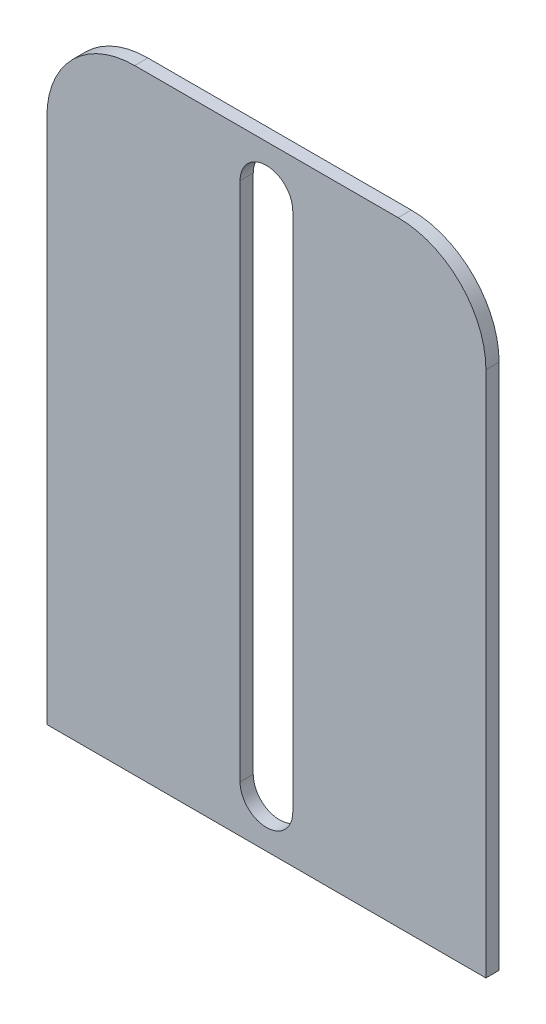
ISO-10303-21;
HEADER;
FILE_DESCRIPTION(('STEP AP214'),'2;1');
FILE_NAME('part.step','',(''),(''),'','','');
FILE_SCHEMA(('AUTOMOTIVE_DESIGN { 1 0 10303 214 1 1 1 1 }'));
ENDSEC;
DATA;
#1=APPLICATION_CONTEXT('core data for automotive mechanical design processes');
#2=APPLICATION_PROTOCOL_DEFINITION('international standard','automotive_design',2000,#1);
#3=PRODUCT_CONTEXT('',#1,'mechanical');
#4=PRODUCT('Part','Part','',(#3));
#5=PRODUCT_RELATED_PRODUCT_CATEGORY('part','',(#4));
#6=PRODUCT_DEFINITION_FORMATION('','',#4);
#7=PRODUCT_DEFINITION_CONTEXT('part definition',#1,'design');
#8=PRODUCT_DEFINITION('design','',#6,#7);
#9=PRODUCT_DEFINITION_SHAPE('','',#8);
#10=(LENGTH_UNIT() NAMED_UNIT(*) SI_UNIT(.MILLI.,.METRE.));
#11=(NAMED_UNIT(*) PLANE_ANGLE_UNIT() SI_UNIT($,.RADIAN.));
#12=(NAMED_UNIT(*) SI_UNIT($,.STERADIAN.) SOLID_ANGLE_UNIT());
#13=UNCERTAINTY_MEASURE_WITH_UNIT(LENGTH_MEASURE(1.E-05),#10,'distance_accuracy_value','');
#14=(GEOMETRIC_REPRESENTATION_CONTEXT(3) GLOBAL_UNCERTAINTY_ASSIGNED_CONTEXT((#13)) GLOBAL_UNIT_ASSIGNED_CONTEXT((#10,
#11,#12)) REPRESENTATION_CONTEXT('',''));
#15=CARTESIAN_POINT('',(0.,0.,0.));
#16=DIRECTION('',(0.,0.,1.));
#17=DIRECTION('',(1.,0.,0.));
#18=AXIS2_PLACEMENT_3D('',#15,#16,#17);
#19=CARTESIAN_POINT('',(0.,0.,1.5));
#20=DIRECTION('',(0.,0.,-1.));
#21=DIRECTION('',(-1.,0.,0.));
#22=AXIS2_PLACEMENT_3D('',#19,#20,#21);
#23=PLANE('',#22);
#24=DIRECTION('',(-1.,0.,0.));
#25=VECTOR('',#24,1.);
#26=CARTESIAN_POINT('',(-25.,35.,1.5));
#27=LINE('',#26,#25);
#28=CARTESIAN_POINT('',(15.,35.,1.5));
#29=VERTEX_POINT('',#28);
#30=CARTESIAN_POINT('',(-15.,35.,1.5));
#31=VERTEX_POINT('',#30);
#32=EDGE_CURVE('E157',#29,#31,#27,.T.);
#33=ORIENTED_EDGE('',*,*,#32,.T.);
#34=CARTESIAN_POINT('',(-15.,25.,1.5));
#35=DIRECTION('',(0.,0.,-1.));
#36=DIRECTION('',(-1.,0.,0.));
#37=AXIS2_PLACEMENT_3D('',#34,#35,#36);
#38=CIRCLE('',#37,10.);
#39=CARTESIAN_POINT('',(-25.,25.,1.5));
#40=VERTEX_POINT('',#39);
#41=EDGE_CURVE('E42',#31,#40,#38,.F.);
#42=ORIENTED_EDGE('',*,*,#41,.T.);
#43=DIRECTION('',(0.,-1.,0.));
#44=VECTOR('',#43,1.);
#45=CARTESIAN_POINT('',(-25.,-35.,1.5));
#46=LINE('',#45,#44);
#47=CARTESIAN_POINT('',(-25.,-35.,1.5));
#48=VERTEX_POINT('',#47);
#49=EDGE_CURVE('E160',#40,#48,#46,.T.);
#50=ORIENTED_EDGE('',*,*,#49,.T.);
#51=DIRECTION('',(1.,0.,0.));
#52=VECTOR('',#51,1.);
#53=CARTESIAN_POINT('',(-25.,-35.,1.5));
#54=LINE('',#53,#52);
#55=CARTESIAN_POINT('',(25.,-35.,1.5));
#56=VERTEX_POINT('',#55);
#57=EDGE_CURVE('E162',#48,#56,#54,.T.);
#58=ORIENTED_EDGE('',*,*,#57,.T.);
#59=DIRECTION('',(0.,1.,0.));
#60=VECTOR('',#59,1.);
#61=CARTESIAN_POINT('',(25.,-35.,1.5));
#62=LINE('',#61,#60);
#63=CARTESIAN_POINT('',(25.,25.,1.5));
#64=VERTEX_POINT('',#63);
#65=EDGE_CURVE('E155',#56,#64,#62,.T.);
#66=ORIENTED_EDGE('',*,*,#65,.T.);
#67=CARTESIAN_POINT('',(15.,25.,1.5));
#68=DIRECTION('',(0.,0.,-1.));
#69=DIRECTION('',(-1.,0.,0.));
#70=AXIS2_PLACEMENT_3D('',#67,#68,#69);
#71=CIRCLE('',#70,10.);
#72=EDGE_CURVE('E187',#64,#29,#71,.F.);
#73=ORIENTED_EDGE('',*,*,#72,.T.);
#74=EDGE_LOOP('',(#33,#42,#50,#58,#66,#73));
#75=FACE_BOUND('',#74,.T.);
#76=CARTESIAN_POINT('',(0.,-29.6532805848947,1.5));
#77=DIRECTION('',(0.,0.,1.));
#78=DIRECTION('',(1.,0.,0.));
#79=AXIS2_PLACEMENT_3D('',#76,#77,#78);
#80=CIRCLE('',#79,3.);
#81=CARTESIAN_POINT('',(-3.,-29.6532805848947,1.5));
#82=VERTEX_POINT('',#81);
#83=CARTESIAN_POINT('',(3.,-29.6532805848947,1.5));
#84=VERTEX_POINT('',#83);
#85=EDGE_CURVE('E114',#82,#84,#80,.T.);
#86=ORIENTED_EDGE('',*,*,#85,.F.);
#87=DIRECTION('',(0.,-1.,0.));
#88=VECTOR('',#87,1.);
#89=CARTESIAN_POINT('',(-3.,-29.6532805848947,1.5));
#90=LINE('',#89,#88);
#91=CARTESIAN_POINT('',(-3.,29.6532805848947,1.5));
#92=VERTEX_POINT('',#91);
#93=EDGE_CURVE('E139',#92,#82,#90,.T.);
#94=ORIENTED_EDGE('',*,*,#93,.F.);
#95=CARTESIAN_POINT('',(0.,29.6532805848947,1.5));
#96=DIRECTION('',(0.,0.,1.));
#97=DIRECTION('',(1.,0.,0.));
#98=AXIS2_PLACEMENT_3D('',#95,#96,#97);
#99=CIRCLE('',#98,3.);
#100=CARTESIAN_POINT('',(3.,29.6532805848947,1.5));
#101=VERTEX_POINT('',#100);
#102=EDGE_CURVE('E137',#101,#92,#99,.T.);
#103=ORIENTED_EDGE('',*,*,#102,.F.);
#104=DIRECTION('',(0.,1.,0.));
#105=VECTOR('',#104,1.);
#106=CARTESIAN_POINT('',(3.,-29.6532805848947,1.5));
#107=LINE('',#106,#105);
#108=EDGE_CURVE('E124',#84,#101,#107,.T.);
#109=ORIENTED_EDGE('',*,*,#108,.F.);
#110=EDGE_LOOP('',(#86,#94,#103,#109));
#111=FACE_BOUND('',#110,.T.);
#112=ADVANCED_FACE('F34',(#75,#111),#23,.F.);
#113=CARTESIAN_POINT('',(0.,0.,0.));
#114=DIRECTION('',(0.,0.,-1.));
#115=DIRECTION('',(-1.,0.,0.));
#116=AXIS2_PLACEMENT_3D('',#113,#114,#115);
#117=PLANE('',#116);
#118=DIRECTION('',(0.,-1.,0.));
#119=VECTOR('',#118,1.);
#120=CARTESIAN_POINT('',(-25.,-35.,0.));
#121=LINE('',#120,#119);
#122=CARTESIAN_POINT('',(-25.,25.,0.));
#123=VERTEX_POINT('',#122);
#124=CARTESIAN_POINT('',(-25.,-35.,0.));
#125=VERTEX_POINT('',#124);
#126=EDGE_CURVE('E168',#123,#125,#121,.T.);
#127=ORIENTED_EDGE('',*,*,#126,.F.);
#128=CARTESIAN_POINT('',(-15.,25.,0.));
#129=DIRECTION('',(0.,0.,-1.));
#130=DIRECTION('',(-1.,0.,0.));
#131=AXIS2_PLACEMENT_3D('',#128,#129,#130);
#132=CIRCLE('',#131,10.);
#133=CARTESIAN_POINT('',(-15.,35.,0.));
#134=VERTEX_POINT('',#133);
#135=EDGE_CURVE('E181',#123,#134,#132,.T.);
#136=ORIENTED_EDGE('',*,*,#135,.T.);
#137=DIRECTION('',(-1.,0.,0.));
#138=VECTOR('',#137,1.);
#139=CARTESIAN_POINT('',(-25.,35.,0.));
#140=LINE('',#139,#138);
#141=CARTESIAN_POINT('',(15.,35.,0.));
#142=VERTEX_POINT('',#141);
#143=EDGE_CURVE('E166',#142,#134,#140,.T.);
#144=ORIENTED_EDGE('',*,*,#143,.F.);
#145=CARTESIAN_POINT('',(15.,25.,0.));
#146=DIRECTION('',(0.,0.,-1.));
#147=DIRECTION('',(-1.,0.,0.));
#148=AXIS2_PLACEMENT_3D('',#145,#146,#147);
#149=CIRCLE('',#148,10.);
#150=CARTESIAN_POINT('',(25.,25.,0.));
#151=VERTEX_POINT('',#150);
#152=EDGE_CURVE('E179',#142,#151,#149,.T.);
#153=ORIENTED_EDGE('',*,*,#152,.T.);
#154=DIRECTION('',(0.,1.,0.));
#155=VECTOR('',#154,1.);
#156=CARTESIAN_POINT('',(25.,-35.,0.));
#157=LINE('',#156,#155);
#158=CARTESIAN_POINT('',(25.,-35.,0.));
#159=VERTEX_POINT('',#158);
#160=EDGE_CURVE('E132',#159,#151,#157,.T.);
#161=ORIENTED_EDGE('',*,*,#160,.F.);
#162=DIRECTION('',(1.,0.,0.));
#163=VECTOR('',#162,1.);
#164=CARTESIAN_POINT('',(-25.,-35.,0.));
#165=LINE('',#164,#163);
#166=EDGE_CURVE('E158',#125,#159,#165,.T.);
#167=ORIENTED_EDGE('',*,*,#166,.F.);
#168=EDGE_LOOP('',(#127,#136,#144,#153,#161,#167));
#169=FACE_BOUND('',#168,.T.);
#170=DIRECTION('',(0.,-1.,0.));
#171=VECTOR('',#170,1.);
#172=CARTESIAN_POINT('',(-3.,-29.6532805848947,0.));
#173=LINE('',#172,#171);
#174=CARTESIAN_POINT('',(-3.,29.6532805848947,0.));
#175=VERTEX_POINT('',#174);
#176=CARTESIAN_POINT('',(-3.,-29.6532805848947,0.));
#177=VERTEX_POINT('',#176);
#178=EDGE_CURVE('E125',#175,#177,#173,.T.);
#179=ORIENTED_EDGE('',*,*,#178,.T.);
#180=CARTESIAN_POINT('',(0.,-29.6532805848947,0.));
#181=DIRECTION('',(0.,0.,1.));
#182=DIRECTION('',(1.,0.,0.));
#183=AXIS2_PLACEMENT_3D('',#180,#181,#182);
#184=CIRCLE('',#183,3.);
#185=CARTESIAN_POINT('',(3.,-29.6532805848947,0.));
#186=VERTEX_POINT('',#185);
#187=EDGE_CURVE('E143',#177,#186,#184,.T.);
#188=ORIENTED_EDGE('',*,*,#187,.T.);
#189=DIRECTION('',(0.,1.,0.));
#190=VECTOR('',#189,1.);
#191=CARTESIAN_POINT('',(3.,-29.6532805848947,0.));
#192=LINE('',#191,#190);
#193=CARTESIAN_POINT('',(3.,29.6532805848947,0.));
#194=VERTEX_POINT('',#193);
#195=EDGE_CURVE('E131',#186,#194,#192,.T.);
#196=ORIENTED_EDGE('',*,*,#195,.T.);
#197=CARTESIAN_POINT('',(0.,29.6532805848947,0.));
#198=DIRECTION('',(0.,0.,1.));
#199=DIRECTION('',(1.,0.,0.));
#200=AXIS2_PLACEMENT_3D('',#197,#198,#199);
#201=CIRCLE('',#200,3.);
#202=EDGE_CURVE('E146',#194,#175,#201,.T.);
#203=ORIENTED_EDGE('',*,*,#202,.T.);
#204=EDGE_LOOP('',(#179,#188,#196,#203));
#205=FACE_BOUND('',#204,.T.);
#206=ADVANCED_FACE('F201',(#169,#205),#117,.T.);
#207=CARTESIAN_POINT('',(25.,-35.,1.5));
#208=DIRECTION('',(-1.,0.,0.));
#209=DIRECTION('',(0.,0.,1.));
#210=AXIS2_PLACEMENT_3D('',#207,#208,#209);
#211=PLANE('',#210);
#212=ORIENTED_EDGE('',*,*,#160,.T.);
#213=DIRECTION('',(0.,0.,-1.));
#214=VECTOR('',#213,1.);
#215=CARTESIAN_POINT('',(25.,25.,1.5));
#216=LINE('',#215,#214);
#217=EDGE_CURVE('E11',#151,#64,#216,.F.);
#218=ORIENTED_EDGE('',*,*,#217,.T.);
#219=ORIENTED_EDGE('',*,*,#65,.F.);
#220=DIRECTION('',(0.,0.,-1.));
#221=VECTOR('',#220,1.);
#222=CARTESIAN_POINT('',(25.,-35.,1.5));
#223=LINE('',#222,#221);
#224=EDGE_CURVE('E164',#56,#159,#223,.T.);
#225=ORIENTED_EDGE('',*,*,#224,.T.);
#226=EDGE_LOOP('',(#212,#218,#219,#225));
#227=FACE_BOUND('',#226,.T.);
#228=ADVANCED_FACE('F209',(#227),#211,.F.);
#229=CARTESIAN_POINT('',(-25.,35.,1.5));
#230=DIRECTION('',(0.,-1.,0.));
#231=DIRECTION('',(0.,0.,-1.));
#232=AXIS2_PLACEMENT_3D('',#229,#230,#231);
#233=PLANE('',#232);
#234=ORIENTED_EDGE('',*,*,#143,.T.);
#235=DIRECTION('',(0.,0.,-1.));
#236=VECTOR('',#235,1.);
#237=CARTESIAN_POINT('',(-15.,35.,1.5));
#238=LINE('',#237,#236);
#239=EDGE_CURVE('E55',#134,#31,#238,.F.);
#240=ORIENTED_EDGE('',*,*,#239,.T.);
#241=ORIENTED_EDGE('',*,*,#32,.F.);
#242=DIRECTION('',(0.,0.,-1.));
#243=VECTOR('',#242,1.);
#244=CARTESIAN_POINT('',(15.,35.,1.5));
#245=LINE('',#244,#243);
#246=EDGE_CURVE('E183',#29,#142,#245,.T.);
#247=ORIENTED_EDGE('',*,*,#246,.T.);
#248=EDGE_LOOP('',(#234,#240,#241,#247));
#249=FACE_BOUND('',#248,.T.);
#250=ADVANCED_FACE('F204',(#249),#233,.F.);
#251=CARTESIAN_POINT('',(-25.,-35.,1.5));
#252=DIRECTION('',(1.,0.,0.));
#253=DIRECTION('',(0.,0.,-1.));
#254=AXIS2_PLACEMENT_3D('',#251,#252,#253);
#255=PLANE('',#254);
#256=ORIENTED_EDGE('',*,*,#49,.F.);
#257=DIRECTION('',(0.,0.,-1.));
#258=VECTOR('',#257,1.);
#259=CARTESIAN_POINT('',(-25.,25.,1.5));
#260=LINE('',#259,#258);
#261=EDGE_CURVE('E176',#40,#123,#260,.T.);
#262=ORIENTED_EDGE('',*,*,#261,.T.);
#263=ORIENTED_EDGE('',*,*,#126,.T.);
#264=DIRECTION('',(0.,0.,-1.));
#265=VECTOR('',#264,1.);
#266=CARTESIAN_POINT('',(-25.,-35.,1.5));
#267=LINE('',#266,#265);
#268=EDGE_CURVE('E173',#48,#125,#267,.T.);
#269=ORIENTED_EDGE('',*,*,#268,.F.);
#270=EDGE_LOOP('',(#256,#262,#263,#269));
#271=FACE_BOUND('',#270,.T.);
#272=ADVANCED_FACE('F195',(#271),#255,.F.);
#273=CARTESIAN_POINT('',(-25.,-35.,1.5));
#274=DIRECTION('',(0.,1.,0.));
#275=DIRECTION('',(0.,0.,1.));
#276=AXIS2_PLACEMENT_3D('',#273,#274,#275);
#277=PLANE('',#276);
#278=ORIENTED_EDGE('',*,*,#166,.T.);
#279=ORIENTED_EDGE('',*,*,#224,.F.);
#280=ORIENTED_EDGE('',*,*,#57,.F.);
#281=ORIENTED_EDGE('',*,*,#268,.T.);
#282=EDGE_LOOP('',(#278,#279,#280,#281));
#283=FACE_BOUND('',#282,.T.);
#284=ADVANCED_FACE('F212',(#283),#277,.F.);
#285=CARTESIAN_POINT('',(0.,-29.6532805848947,1.5));
#286=DIRECTION('',(0.,0.,-1.));
#287=DIRECTION('',(-1.,0.,0.));
#288=AXIS2_PLACEMENT_3D('',#285,#286,#287);
#289=CYLINDRICAL_SURFACE('',#288,3.);
#290=ORIENTED_EDGE('',*,*,#187,.F.);
#291=DIRECTION('',(0.,0.,-1.));
#292=VECTOR('',#291,1.);
#293=CARTESIAN_POINT('',(-3.,-29.6532805848947,1.5));
#294=LINE('',#293,#292);
#295=EDGE_CURVE('E120',#82,#177,#294,.T.);
#296=ORIENTED_EDGE('',*,*,#295,.F.);
#297=ORIENTED_EDGE('',*,*,#85,.T.);
#298=DIRECTION('',(0.,0.,-1.));
#299=VECTOR('',#298,1.);
#300=CARTESIAN_POINT('',(3.,-29.6532805848947,1.5));
#301=LINE('',#300,#299);
#302=EDGE_CURVE('E117',#84,#186,#301,.T.);
#303=ORIENTED_EDGE('',*,*,#302,.T.);
#304=EDGE_LOOP('',(#290,#296,#297,#303));
#305=FACE_BOUND('',#304,.T.);
#306=ADVANCED_FACE('F116',(#305),#289,.F.);
#307=CARTESIAN_POINT('',(3.,-29.6532805848947,1.5));
#308=DIRECTION('',(-1.,0.,0.));
#309=DIRECTION('',(0.,0.,1.));
#310=AXIS2_PLACEMENT_3D('',#307,#308,#309);
#311=PLANE('',#310);
#312=ORIENTED_EDGE('',*,*,#195,.F.);
#313=ORIENTED_EDGE('',*,*,#302,.F.);
#314=ORIENTED_EDGE('',*,*,#108,.T.);
#315=DIRECTION('',(0.,0.,-1.));
#316=VECTOR('',#315,1.);
#317=CARTESIAN_POINT('',(3.,29.6532805848947,1.5));
#318=LINE('',#317,#316);
#319=EDGE_CURVE('E133',#101,#194,#318,.T.);
#320=ORIENTED_EDGE('',*,*,#319,.T.);
#321=EDGE_LOOP('',(#312,#313,#314,#320));
#322=FACE_BOUND('',#321,.T.);
#323=ADVANCED_FACE('F128',(#322),#311,.T.);
#324=CARTESIAN_POINT('',(0.,29.6532805848947,1.5));
#325=DIRECTION('',(0.,0.,-1.));
#326=DIRECTION('',(-1.,0.,0.));
#327=AXIS2_PLACEMENT_3D('',#324,#325,#326);
#328=CYLINDRICAL_SURFACE('',#327,3.);
#329=ORIENTED_EDGE('',*,*,#202,.F.);
#330=ORIENTED_EDGE('',*,*,#319,.F.);
#331=ORIENTED_EDGE('',*,*,#102,.T.);
#332=DIRECTION('',(0.,0.,-1.));
#333=VECTOR('',#332,1.);
#334=CARTESIAN_POINT('',(-3.,29.6532805848947,1.5));
#335=LINE('',#334,#333);
#336=EDGE_CURVE('E152',#92,#175,#335,.T.);
#337=ORIENTED_EDGE('',*,*,#336,.T.);
#338=EDGE_LOOP('',(#329,#330,#331,#337));
#339=FACE_BOUND('',#338,.T.);
#340=ADVANCED_FACE('F230',(#339),#328,.F.);
#341=CARTESIAN_POINT('',(-3.,-29.6532805848947,1.5));
#342=DIRECTION('',(1.,0.,0.));
#343=DIRECTION('',(0.,0.,-1.));
#344=AXIS2_PLACEMENT_3D('',#341,#342,#343);
#345=PLANE('',#344);
#346=ORIENTED_EDGE('',*,*,#178,.F.);
#347=ORIENTED_EDGE('',*,*,#336,.F.);
#348=ORIENTED_EDGE('',*,*,#93,.T.);
#349=ORIENTED_EDGE('',*,*,#295,.T.);
#350=EDGE_LOOP('',(#346,#347,#348,#349));
#351=FACE_BOUND('',#350,.T.);
#352=ADVANCED_FACE('F233',(#351),#345,.T.);
#353=CARTESIAN_POINT('',(-15.,25.,1.5));
#354=DIRECTION('',(0.,0.,-1.));
#355=DIRECTION('',(-1.,0.,0.));
#356=AXIS2_PLACEMENT_3D('',#353,#354,#355);
#357=CYLINDRICAL_SURFACE('',#356,10.);
#358=ORIENTED_EDGE('',*,*,#41,.F.);
#359=ORIENTED_EDGE('',*,*,#239,.F.);
#360=ORIENTED_EDGE('',*,*,#135,.F.);
#361=ORIENTED_EDGE('',*,*,#261,.F.);
#362=EDGE_LOOP('',(#358,#359,#360,#361));
#363=FACE_BOUND('',#362,.T.);
#364=ADVANCED_FACE('F198',(#363),#357,.T.);
#365=CARTESIAN_POINT('',(15.,25.,1.5));
#366=DIRECTION('',(0.,0.,-1.));
#367=DIRECTION('',(-1.,0.,0.));
#368=AXIS2_PLACEMENT_3D('',#365,#366,#367);
#369=CYLINDRICAL_SURFACE('',#368,10.);
#370=ORIENTED_EDGE('',*,*,#72,.F.);
#371=ORIENTED_EDGE('',*,*,#217,.F.);
#372=ORIENTED_EDGE('',*,*,#152,.F.);
#373=ORIENTED_EDGE('',*,*,#246,.F.);
#374=EDGE_LOOP('',(#370,#371,#372,#373));
#375=FACE_BOUND('',#374,.T.);
#376=ADVANCED_FACE('F36',(#375),#369,.T.);
#377=CLOSED_SHELL('',(#112,#206,#228,#250,#272,#284,#306,#323,#340,#352,#364,#376));
#378=MANIFOLD_SOLID_BREP('B2',#377);
#379=ADVANCED_BREP_SHAPE_REPRESENTATION('',(#18,#378),#14);
#380=SHAPE_DEFINITION_REPRESENTATION(#9,#379);
ENDSEC;
END-ISO-10303-21;
